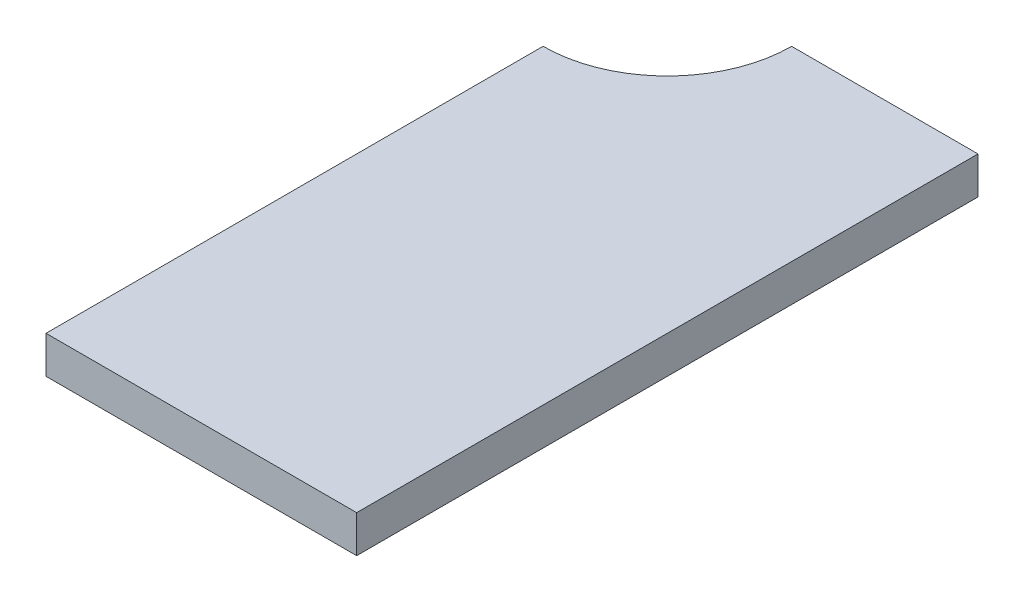
ISO-10303-21;
HEADER;
FILE_DESCRIPTION(('STEP AP214'),'2;1');
FILE_NAME('part.step','',(''),(''),'','','');
FILE_SCHEMA(('AUTOMOTIVE_DESIGN { 1 0 10303 214 1 1 1 1 }'));
ENDSEC;
DATA;
#1=APPLICATION_CONTEXT('core data for automotive mechanical design processes');
#2=APPLICATION_PROTOCOL_DEFINITION('international standard','automotive_design',2000,#1);
#3=PRODUCT_CONTEXT('',#1,'mechanical');
#4=PRODUCT('Part','Part','',(#3));
#5=PRODUCT_RELATED_PRODUCT_CATEGORY('part','',(#4));
#6=PRODUCT_DEFINITION_FORMATION('','',#4);
#7=PRODUCT_DEFINITION_CONTEXT('part definition',#1,'design');
#8=PRODUCT_DEFINITION('design','',#6,#7);
#9=PRODUCT_DEFINITION_SHAPE('','',#8);
#10=(LENGTH_UNIT() NAMED_UNIT(*) SI_UNIT(.MILLI.,.METRE.));
#11=(NAMED_UNIT(*) PLANE_ANGLE_UNIT() SI_UNIT($,.RADIAN.));
#12=(NAMED_UNIT(*) SI_UNIT($,.STERADIAN.) SOLID_ANGLE_UNIT());
#13=UNCERTAINTY_MEASURE_WITH_UNIT(LENGTH_MEASURE(1.E-05),#10,'distance_accuracy_value','');
#14=(GEOMETRIC_REPRESENTATION_CONTEXT(3) GLOBAL_UNCERTAINTY_ASSIGNED_CONTEXT((#13)) GLOBAL_UNIT_ASSIGNED_CONTEXT((#10,
#11,#12)) REPRESENTATION_CONTEXT('',''));
#15=CARTESIAN_POINT('',(0.,0.,0.));
#16=DIRECTION('',(0.,0.,1.));
#17=DIRECTION('',(1.,0.,0.));
#18=AXIS2_PLACEMENT_3D('',#15,#16,#17);
#19=CARTESIAN_POINT('',(-4.3529,3.0056,-3.1790000000001));
#20=DIRECTION('',(0.,0.,-1.));
#21=DIRECTION('',(-1.,0.,0.));
#22=AXIS2_PLACEMENT_3D('',#19,#20,#21);
#23=PLANE('',#22);
#24=DIRECTION('',(1.,0.,0.));
#25=VECTOR('',#24,1.);
#26=CARTESIAN_POINT('',(-4.3529,2.9756,-3.1790000000001));
#27=LINE('',#26,#25);
#28=CARTESIAN_POINT('',(-4.6029,2.9756,-3.1790000000001));
#29=VERTEX_POINT('',#28);
#30=CARTESIAN_POINT('',(-4.3529,2.9756,-3.1790000000001));
#31=VERTEX_POINT('',#30);
#32=EDGE_CURVE('E11',#29,#31,#27,.T.);
#33=ORIENTED_EDGE('',*,*,#32,.T.);
#34=DIRECTION('',(0.,-1.,0.));
#35=VECTOR('',#34,1.);
#36=CARTESIAN_POINT('',(-4.3529,3.0056,-3.1790000000001));
#37=LINE('',#36,#35);
#38=CARTESIAN_POINT('',(-4.3529,3.0056,-3.1790000000001));
#39=VERTEX_POINT('',#38);
#40=EDGE_CURVE('E24',#39,#31,#37,.T.);
#41=ORIENTED_EDGE('',*,*,#40,.F.);
#42=DIRECTION('',(1.,0.,0.));
#43=VECTOR('',#42,1.);
#44=CARTESIAN_POINT('',(-4.3529,3.0056,-3.1790000000001));
#45=LINE('',#44,#43);
#46=CARTESIAN_POINT('',(-4.6029,3.0056,-3.1790000000001));
#47=VERTEX_POINT('',#46);
#48=EDGE_CURVE('E102',#47,#39,#45,.T.);
#49=ORIENTED_EDGE('',*,*,#48,.F.);
#50=DIRECTION('',(0.,-1.,0.));
#51=VECTOR('',#50,1.);
#52=CARTESIAN_POINT('',(-4.6029,3.0056,-3.1790000000001));
#53=LINE('',#52,#51);
#54=EDGE_CURVE('E84',#47,#29,#53,.T.);
#55=ORIENTED_EDGE('',*,*,#54,.T.);
#56=EDGE_LOOP('',(#33,#41,#49,#55));
#57=FACE_BOUND('',#56,.T.);
#58=ADVANCED_FACE('F17',(#57),#23,.F.);
#59=CARTESIAN_POINT('',(-4.3529,3.0056,-3.6790000000001));
#60=DIRECTION('',(-1.,0.,0.));
#61=DIRECTION('',(0.,0.,1.));
#62=AXIS2_PLACEMENT_3D('',#59,#60,#61);
#63=PLANE('',#62);
#64=DIRECTION('',(0.,0.,-1.));
#65=VECTOR('',#64,1.);
#66=CARTESIAN_POINT('',(-4.3529,2.9756,-3.6790000000001));
#67=LINE('',#66,#65);
#68=CARTESIAN_POINT('',(-4.3529,2.9756,-3.6790000000001));
#69=VERTEX_POINT('',#68);
#70=EDGE_CURVE('E99',#31,#69,#67,.T.);
#71=ORIENTED_EDGE('',*,*,#70,.T.);
#72=DIRECTION('',(0.,-1.,0.));
#73=VECTOR('',#72,1.);
#74=CARTESIAN_POINT('',(-4.3529,3.0056,-3.6790000000001));
#75=LINE('',#74,#73);
#76=CARTESIAN_POINT('',(-4.3529,3.0056,-3.6790000000001));
#77=VERTEX_POINT('',#76);
#78=EDGE_CURVE('E96',#77,#69,#75,.T.);
#79=ORIENTED_EDGE('',*,*,#78,.F.);
#80=DIRECTION('',(0.,0.,-1.));
#81=VECTOR('',#80,1.);
#82=CARTESIAN_POINT('',(-4.3529,3.0056,-3.6790000000001));
#83=LINE('',#82,#81);
#84=EDGE_CURVE('E94',#39,#77,#83,.T.);
#85=ORIENTED_EDGE('',*,*,#84,.F.);
#86=ORIENTED_EDGE('',*,*,#40,.T.);
#87=EDGE_LOOP('',(#71,#79,#85,#86));
#88=FACE_BOUND('',#87,.T.);
#89=ADVANCED_FACE('F105',(#88),#63,.F.);
#90=CARTESIAN_POINT('',(-4.3529,3.0056,-3.6790000000001));
#91=DIRECTION('',(0.,0.,1.));
#92=DIRECTION('',(1.,0.,0.));
#93=AXIS2_PLACEMENT_3D('',#90,#91,#92);
#94=PLANE('',#93);
#95=DIRECTION('',(-1.,0.,0.));
#96=VECTOR('',#95,1.);
#97=CARTESIAN_POINT('',(-4.3529,2.9756,-3.6790000000001));
#98=LINE('',#97,#96);
#99=CARTESIAN_POINT('',(-4.5029,2.9756,-3.6790000000001));
#100=VERTEX_POINT('',#99);
#101=EDGE_CURVE('E92',#69,#100,#98,.T.);
#102=ORIENTED_EDGE('',*,*,#101,.T.);
#103=DIRECTION('',(0.,-1.,0.));
#104=VECTOR('',#103,1.);
#105=CARTESIAN_POINT('',(-4.5029,3.0056,-3.6790000000001));
#106=LINE('',#105,#104);
#107=CARTESIAN_POINT('',(-4.5029,3.0056,-3.6790000000001));
#108=VERTEX_POINT('',#107);
#109=EDGE_CURVE('E90',#108,#100,#106,.T.);
#110=ORIENTED_EDGE('',*,*,#109,.F.);
#111=DIRECTION('',(-1.,0.,0.));
#112=VECTOR('',#111,1.);
#113=CARTESIAN_POINT('',(-4.3529,3.0056,-3.6790000000001));
#114=LINE('',#113,#112);
#115=EDGE_CURVE('E69',#77,#108,#114,.T.);
#116=ORIENTED_EDGE('',*,*,#115,.F.);
#117=ORIENTED_EDGE('',*,*,#78,.T.);
#118=EDGE_LOOP('',(#102,#110,#116,#117));
#119=FACE_BOUND('',#118,.T.);
#120=ADVANCED_FACE('F109',(#119),#94,.F.);
#121=CARTESIAN_POINT('',(-4.6029,3.0056,-3.6790000000001));
#122=DIRECTION('',(0.,-1.,0.));
#123=DIRECTION('',(0.,0.,-1.));
#124=AXIS2_PLACEMENT_3D('',#121,#122,#123);
#125=CYLINDRICAL_SURFACE('',#124,0.0999999999999998);
#126=CARTESIAN_POINT('',(-4.6029,2.9756,-3.6790000000001));
#127=DIRECTION('',(0.,-1.,0.));
#128=DIRECTION('',(0.,0.,1.));
#129=AXIS2_PLACEMENT_3D('',#126,#127,#128);
#130=CIRCLE('',#129,0.0999999999999998);
#131=CARTESIAN_POINT('',(-4.6029,2.9756,-3.5790000000001));
#132=VERTEX_POINT('',#131);
#133=EDGE_CURVE('E78',#100,#132,#130,.T.);
#134=ORIENTED_EDGE('',*,*,#133,.T.);
#135=DIRECTION('',(0.,-1.,0.));
#136=VECTOR('',#135,1.);
#137=CARTESIAN_POINT('',(-4.6029,3.0056,-3.5790000000001));
#138=LINE('',#137,#136);
#139=CARTESIAN_POINT('',(-4.6029,3.0056,-3.5790000000001));
#140=VERTEX_POINT('',#139);
#141=EDGE_CURVE('E72',#140,#132,#138,.T.);
#142=ORIENTED_EDGE('',*,*,#141,.F.);
#143=CARTESIAN_POINT('',(-4.6029,3.0056,-3.6790000000001));
#144=DIRECTION('',(0.,-1.,0.));
#145=DIRECTION('',(0.,0.,1.));
#146=AXIS2_PLACEMENT_3D('',#143,#144,#145);
#147=CIRCLE('',#146,0.0999999999999998);
#148=EDGE_CURVE('E61',#108,#140,#147,.T.);
#149=ORIENTED_EDGE('',*,*,#148,.F.);
#150=ORIENTED_EDGE('',*,*,#109,.T.);
#151=EDGE_LOOP('',(#134,#142,#149,#150));
#152=FACE_BOUND('',#151,.T.);
#153=ADVANCED_FACE('F76',(#152),#125,.F.);
#154=CARTESIAN_POINT('',(-4.6029,3.0056,-3.5790000000001));
#155=DIRECTION('',(1.,0.,0.));
#156=DIRECTION('',(0.,0.,-1.));
#157=AXIS2_PLACEMENT_3D('',#154,#155,#156);
#158=PLANE('',#157);
#159=DIRECTION('',(0.,0.,1.));
#160=VECTOR('',#159,1.);
#161=CARTESIAN_POINT('',(-4.6029,2.9756,-3.5790000000001));
#162=LINE('',#161,#160);
#163=EDGE_CURVE('E73',#132,#29,#162,.T.);
#164=ORIENTED_EDGE('',*,*,#163,.T.);
#165=ORIENTED_EDGE('',*,*,#54,.F.);
#166=DIRECTION('',(0.,0.,1.));
#167=VECTOR('',#166,1.);
#168=CARTESIAN_POINT('',(-4.6029,3.0056,-3.5790000000001));
#169=LINE('',#168,#167);
#170=EDGE_CURVE('E66',#140,#47,#169,.T.);
#171=ORIENTED_EDGE('',*,*,#170,.F.);
#172=ORIENTED_EDGE('',*,*,#141,.T.);
#173=EDGE_LOOP('',(#164,#165,#171,#172));
#174=FACE_BOUND('',#173,.T.);
#175=ADVANCED_FACE('F83',(#174),#158,.F.);
#176=CARTESIAN_POINT('',(-4.6029,3.0056,-3.6790000000001));
#177=DIRECTION('',(0.,1.,0.));
#178=DIRECTION('',(0.,0.,1.));
#179=AXIS2_PLACEMENT_3D('',#176,#177,#178);
#180=PLANE('',#179);
#181=ORIENTED_EDGE('',*,*,#48,.T.);
#182=ORIENTED_EDGE('',*,*,#84,.T.);
#183=ORIENTED_EDGE('',*,*,#115,.T.);
#184=ORIENTED_EDGE('',*,*,#148,.T.);
#185=ORIENTED_EDGE('',*,*,#170,.T.);
#186=EDGE_LOOP('',(#181,#182,#183,#184,#185));
#187=FACE_BOUND('',#186,.T.);
#188=ADVANCED_FACE('F64',(#187),#180,.T.);
#189=CARTESIAN_POINT('',(-4.6029,2.9756,-3.6790000000001));
#190=DIRECTION('',(0.,1.,0.));
#191=DIRECTION('',(0.,0.,1.));
#192=AXIS2_PLACEMENT_3D('',#189,#190,#191);
#193=PLANE('',#192);
#194=ORIENTED_EDGE('',*,*,#32,.F.);
#195=ORIENTED_EDGE('',*,*,#163,.F.);
#196=ORIENTED_EDGE('',*,*,#133,.F.);
#197=ORIENTED_EDGE('',*,*,#101,.F.);
#198=ORIENTED_EDGE('',*,*,#70,.F.);
#199=EDGE_LOOP('',(#194,#195,#196,#197,#198));
#200=FACE_BOUND('',#199,.T.);
#201=ADVANCED_FACE('F107',(#200),#193,.F.);
#202=CLOSED_SHELL('',(#58,#89,#120,#153,#175,#188,#201));
#203=MANIFOLD_SOLID_BREP('B1',#202);
#204=ADVANCED_BREP_SHAPE_REPRESENTATION('',(#18,#203),#14);
#205=SHAPE_DEFINITION_REPRESENTATION(#9,#204);
ENDSEC;
END-ISO-10303-21;
